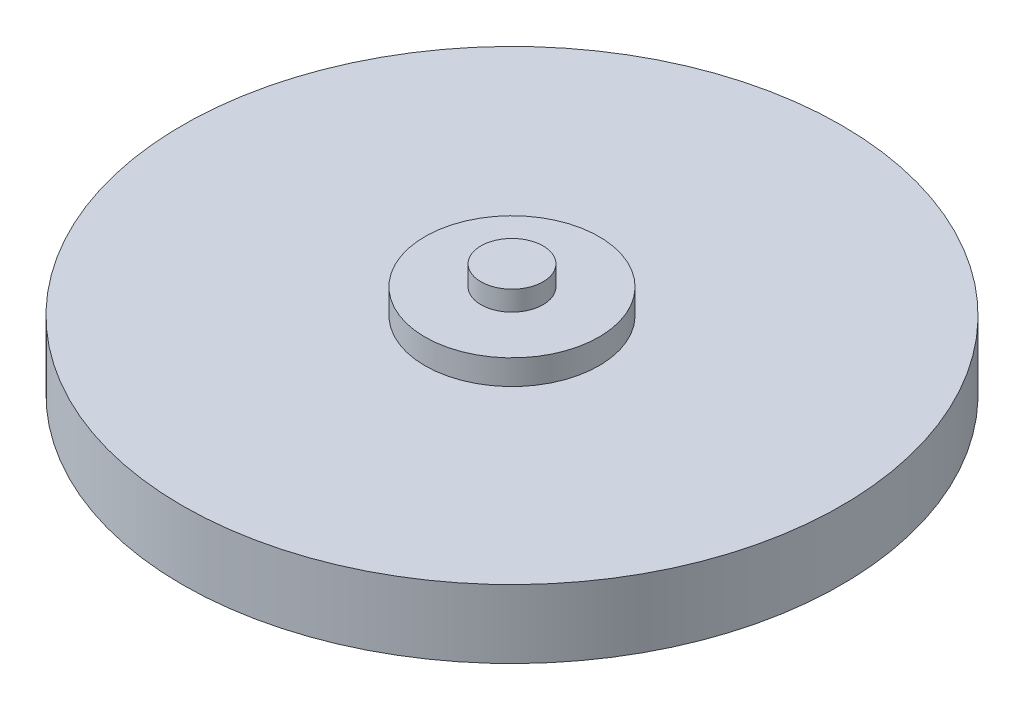
ISO-10303-21;
HEADER;
FILE_DESCRIPTION(('STEP AP214'),'2;1');
FILE_NAME('part.step','',(''),(''),'','','');
FILE_SCHEMA(('AUTOMOTIVE_DESIGN { 1 0 10303 214 1 1 1 1 }'));
ENDSEC;
DATA;
#1=APPLICATION_CONTEXT('core data for automotive mechanical design processes');
#2=APPLICATION_PROTOCOL_DEFINITION('international standard','automotive_design',2000,#1);
#3=PRODUCT_CONTEXT('',#1,'mechanical');
#4=PRODUCT('Part','Part','',(#3));
#5=PRODUCT_RELATED_PRODUCT_CATEGORY('part','',(#4));
#6=PRODUCT_DEFINITION_FORMATION('','',#4);
#7=PRODUCT_DEFINITION_CONTEXT('part definition',#1,'design');
#8=PRODUCT_DEFINITION('design','',#6,#7);
#9=PRODUCT_DEFINITION_SHAPE('','',#8);
#10=(LENGTH_UNIT() NAMED_UNIT(*) SI_UNIT(.MILLI.,.METRE.));
#11=(NAMED_UNIT(*) PLANE_ANGLE_UNIT() SI_UNIT($,.RADIAN.));
#12=(NAMED_UNIT(*) SI_UNIT($,.STERADIAN.) SOLID_ANGLE_UNIT());
#13=UNCERTAINTY_MEASURE_WITH_UNIT(LENGTH_MEASURE(1.E-05),#10,'distance_accuracy_value','');
#14=(GEOMETRIC_REPRESENTATION_CONTEXT(3) GLOBAL_UNCERTAINTY_ASSIGNED_CONTEXT((#13)) GLOBAL_UNIT_ASSIGNED_CONTEXT((#10,
#11,#12)) REPRESENTATION_CONTEXT('',''));
#15=CARTESIAN_POINT('',(0.,0.,0.));
#16=DIRECTION('',(0.,0.,1.));
#17=DIRECTION('',(1.,0.,0.));
#18=AXIS2_PLACEMENT_3D('',#15,#16,#17);
#19=CARTESIAN_POINT('',(0.,3.5,0.));
#20=DIRECTION('',(0.,-1.,0.));
#21=DIRECTION('',(0.,0.,-1.));
#22=AXIS2_PLACEMENT_3D('',#19,#20,#21);
#23=CYLINDRICAL_SURFACE('',#22,26.5);
#24=CARTESIAN_POINT('',(0.,3.5,0.));
#25=DIRECTION('',(0.,1.,0.));
#26=DIRECTION('',(0.,0.,1.));
#27=AXIS2_PLACEMENT_3D('',#24,#25,#26);
#28=CIRCLE('',#27,26.5);
#29=CARTESIAN_POINT('',(0.,3.5,26.5));
#30=VERTEX_POINT('',#29);
#31=EDGE_CURVE('E40',#30,#30,#28,.T.);
#32=ORIENTED_EDGE('',*,*,#31,.F.);
#33=EDGE_LOOP('',(#32));
#34=FACE_BOUND('',#33,.T.);
#35=CARTESIAN_POINT('',(0.,-2.,0.));
#36=DIRECTION('',(0.,-1.,0.));
#37=DIRECTION('',(0.,0.,-1.));
#38=AXIS2_PLACEMENT_3D('',#35,#36,#37);
#39=CIRCLE('',#38,26.5);
#40=CARTESIAN_POINT('',(0.,-2.,-26.5));
#41=VERTEX_POINT('',#40);
#42=EDGE_CURVE('E64',#41,#41,#39,.T.);
#43=ORIENTED_EDGE('',*,*,#42,.F.);
#44=EDGE_LOOP('',(#43));
#45=FACE_BOUND('',#44,.T.);
#46=ADVANCED_FACE('F37',(#34,#45),#23,.T.);
#47=CARTESIAN_POINT('',(0.,3.5,0.));
#48=DIRECTION('',(0.,1.,0.));
#49=DIRECTION('',(0.,0.,1.));
#50=AXIS2_PLACEMENT_3D('',#47,#48,#49);
#51=PLANE('',#50);
#52=CARTESIAN_POINT('',(0.,3.5,0.));
#53=DIRECTION('',(0.,1.,0.));
#54=DIRECTION('',(0.,0.,1.));
#55=AXIS2_PLACEMENT_3D('',#52,#53,#54);
#56=CIRCLE('',#55,7.);
#57=CARTESIAN_POINT('',(0.,3.5,7.));
#58=VERTEX_POINT('',#57);
#59=EDGE_CURVE('E45',#58,#58,#56,.T.);
#60=ORIENTED_EDGE('',*,*,#59,.F.);
#61=EDGE_LOOP('',(#60));
#62=FACE_BOUND('',#61,.T.);
#63=ORIENTED_EDGE('',*,*,#31,.T.);
#64=EDGE_LOOP('',(#63));
#65=FACE_BOUND('',#64,.T.);
#66=ADVANCED_FACE('F95',(#62,#65),#51,.T.);
#67=CARTESIAN_POINT('',(0.,5.5,0.));
#68=DIRECTION('',(0.,-1.,0.));
#69=DIRECTION('',(0.,0.,-1.));
#70=AXIS2_PLACEMENT_3D('',#67,#68,#69);
#71=CYLINDRICAL_SURFACE('',#70,7.);
#72=CARTESIAN_POINT('',(0.,5.5,0.));
#73=DIRECTION('',(0.,1.,0.));
#74=DIRECTION('',(0.,0.,1.));
#75=AXIS2_PLACEMENT_3D('',#72,#73,#74);
#76=CIRCLE('',#75,7.);
#77=CARTESIAN_POINT('',(0.,5.5,7.));
#78=VERTEX_POINT('',#77);
#79=EDGE_CURVE('E55',#78,#78,#76,.T.);
#80=ORIENTED_EDGE('',*,*,#79,.F.);
#81=EDGE_LOOP('',(#80));
#82=FACE_BOUND('',#81,.T.);
#83=ORIENTED_EDGE('',*,*,#59,.T.);
#84=EDGE_LOOP('',(#83));
#85=FACE_BOUND('',#84,.T.);
#86=ADVANCED_FACE('F100',(#82,#85),#71,.T.);
#87=CARTESIAN_POINT('',(0.,5.5,0.));
#88=DIRECTION('',(0.,1.,0.));
#89=DIRECTION('',(0.,0.,1.));
#90=AXIS2_PLACEMENT_3D('',#87,#88,#89);
#91=PLANE('',#90);
#92=CARTESIAN_POINT('',(0.,5.5,0.));
#93=DIRECTION('',(0.,1.,0.));
#94=DIRECTION('',(0.,0.,1.));
#95=AXIS2_PLACEMENT_3D('',#92,#93,#94);
#96=CIRCLE('',#95,2.5);
#97=CARTESIAN_POINT('',(0.,5.5,2.5));
#98=VERTEX_POINT('',#97);
#99=EDGE_CURVE('E10',#98,#98,#96,.T.);
#100=ORIENTED_EDGE('',*,*,#99,.F.);
#101=EDGE_LOOP('',(#100));
#102=FACE_BOUND('',#101,.T.);
#103=ORIENTED_EDGE('',*,*,#79,.T.);
#104=EDGE_LOOP('',(#103));
#105=FACE_BOUND('',#104,.T.);
#106=ADVANCED_FACE('F109',(#102,#105),#91,.T.);
#107=CARTESIAN_POINT('',(0.,7.1,0.));
#108=DIRECTION('',(0.,-1.,0.));
#109=DIRECTION('',(0.,0.,-1.));
#110=AXIS2_PLACEMENT_3D('',#107,#108,#109);
#111=CYLINDRICAL_SURFACE('',#110,2.5);
#112=CARTESIAN_POINT('',(0.,7.1,0.));
#113=DIRECTION('',(0.,1.,0.));
#114=DIRECTION('',(0.,0.,1.));
#115=AXIS2_PLACEMENT_3D('',#112,#113,#114);
#116=CIRCLE('',#115,2.5);
#117=CARTESIAN_POINT('',(0.,7.1,2.5));
#118=VERTEX_POINT('',#117);
#119=EDGE_CURVE('E53',#118,#118,#116,.T.);
#120=ORIENTED_EDGE('',*,*,#119,.F.);
#121=EDGE_LOOP('',(#120));
#122=FACE_BOUND('',#121,.T.);
#123=ORIENTED_EDGE('',*,*,#99,.T.);
#124=EDGE_LOOP('',(#123));
#125=FACE_BOUND('',#124,.T.);
#126=ADVANCED_FACE('F116',(#122,#125),#111,.T.);
#127=CARTESIAN_POINT('',(0.,7.1,0.));
#128=DIRECTION('',(0.,1.,0.));
#129=DIRECTION('',(0.,0.,1.));
#130=AXIS2_PLACEMENT_3D('',#127,#128,#129);
#131=PLANE('',#130);
#132=ORIENTED_EDGE('',*,*,#119,.T.);
#133=EDGE_LOOP('',(#132));
#134=FACE_BOUND('',#133,.T.);
#135=ADVANCED_FACE('F92',(#134),#131,.T.);
#136=CARTESIAN_POINT('',(0.,-2.,0.));
#137=DIRECTION('',(0.,-1.,0.));
#138=DIRECTION('',(0.,0.,-1.));
#139=AXIS2_PLACEMENT_3D('',#136,#137,#138);
#140=PLANE('',#139);
#141=ORIENTED_EDGE('',*,*,#42,.T.);
#142=EDGE_LOOP('',(#141));
#143=FACE_BOUND('',#142,.T.);
#144=CARTESIAN_POINT('',(0.,-2.,0.));
#145=DIRECTION('',(0.,-1.,0.));
#146=DIRECTION('',(0.,0.,-1.));
#147=AXIS2_PLACEMENT_3D('',#144,#145,#146);
#148=CIRCLE('',#147,25.);
#149=CARTESIAN_POINT('',(0.,-2.,-25.));
#150=VERTEX_POINT('',#149);
#151=EDGE_CURVE('E69',#150,#150,#148,.T.);
#152=ORIENTED_EDGE('',*,*,#151,.F.);
#153=EDGE_LOOP('',(#152));
#154=FACE_BOUND('',#153,.T.);
#155=ADVANCED_FACE('F85',(#143,#154),#140,.T.);
#156=CARTESIAN_POINT('',(0.,-2.,0.));
#157=DIRECTION('',(0.,1.,0.));
#158=DIRECTION('',(0.,0.,1.));
#159=AXIS2_PLACEMENT_3D('',#156,#157,#158);
#160=CYLINDRICAL_SURFACE('',#159,25.);
#161=ORIENTED_EDGE('',*,*,#151,.T.);
#162=EDGE_LOOP('',(#161));
#163=FACE_BOUND('',#162,.T.);
#164=CARTESIAN_POINT('',(0.,0.,0.));
#165=DIRECTION('',(0.,-1.,0.));
#166=DIRECTION('',(0.,0.,-1.));
#167=AXIS2_PLACEMENT_3D('',#164,#165,#166);
#168=CIRCLE('',#167,25.);
#169=CARTESIAN_POINT('',(0.,0.,-25.));
#170=VERTEX_POINT('',#169);
#171=EDGE_CURVE('E74',#170,#170,#168,.T.);
#172=ORIENTED_EDGE('',*,*,#171,.F.);
#173=EDGE_LOOP('',(#172));
#174=FACE_BOUND('',#173,.T.);
#175=ADVANCED_FACE('F83',(#163,#174),#160,.F.);
#176=CARTESIAN_POINT('',(0.,0.,0.));
#177=DIRECTION('',(0.,1.,0.));
#178=DIRECTION('',(0.,0.,1.));
#179=AXIS2_PLACEMENT_3D('',#176,#177,#178);
#180=PLANE('',#179);
#181=ORIENTED_EDGE('',*,*,#171,.T.);
#182=EDGE_LOOP('',(#181));
#183=FACE_BOUND('',#182,.T.);
#184=ADVANCED_FACE('F81',(#183),#180,.F.);
#185=CLOSED_SHELL('',(#46,#66,#86,#106,#126,#135,#155,#175,#184));
#186=MANIFOLD_SOLID_BREP('B2',#185);
#187=ADVANCED_BREP_SHAPE_REPRESENTATION('',(#18,#186),#14);
#188=SHAPE_DEFINITION_REPRESENTATION(#9,#187);
ENDSEC;
END-ISO-10303-21;
